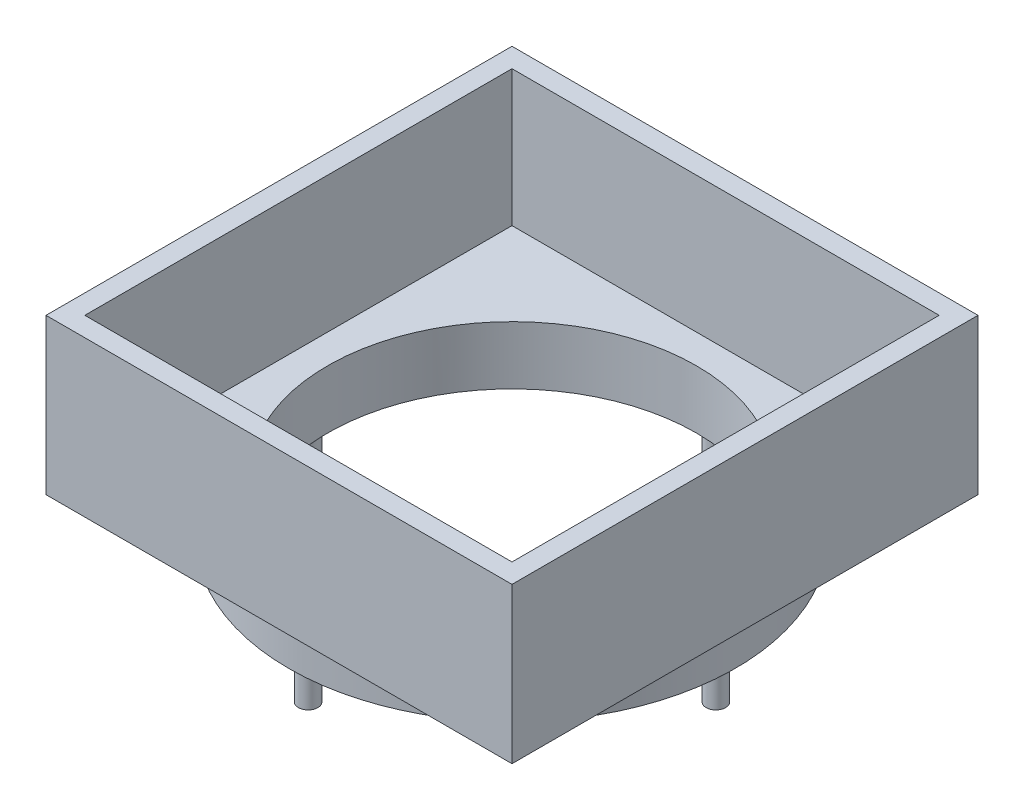
ISO-10303-21;
HEADER;
FILE_DESCRIPTION(('STEP AP214'),'2;1');
FILE_NAME('part.step','',(''),(''),'','','');
FILE_SCHEMA(('AUTOMOTIVE_DESIGN { 1 0 10303 214 1 1 1 1 }'));
ENDSEC;
DATA;
#1=APPLICATION_CONTEXT('core data for automotive mechanical design processes');
#2=APPLICATION_PROTOCOL_DEFINITION('international standard','automotive_design',2000,#1);
#3=PRODUCT_CONTEXT('',#1,'mechanical');
#4=PRODUCT('Part','Part','',(#3));
#5=PRODUCT_RELATED_PRODUCT_CATEGORY('part','',(#4));
#6=PRODUCT_DEFINITION_FORMATION('','',#4);
#7=PRODUCT_DEFINITION_CONTEXT('part definition',#1,'design');
#8=PRODUCT_DEFINITION('design','',#6,#7);
#9=PRODUCT_DEFINITION_SHAPE('','',#8);
#10=(LENGTH_UNIT() NAMED_UNIT(*) SI_UNIT(.MILLI.,.METRE.));
#11=(NAMED_UNIT(*) PLANE_ANGLE_UNIT() SI_UNIT($,.RADIAN.));
#12=(NAMED_UNIT(*) SI_UNIT($,.STERADIAN.) SOLID_ANGLE_UNIT());
#13=UNCERTAINTY_MEASURE_WITH_UNIT(LENGTH_MEASURE(1.E-05),#10,'distance_accuracy_value','');
#14=(GEOMETRIC_REPRESENTATION_CONTEXT(3) GLOBAL_UNCERTAINTY_ASSIGNED_CONTEXT((#13)) GLOBAL_UNIT_ASSIGNED_CONTEXT((#10,
#11,#12)) REPRESENTATION_CONTEXT('',''));
#15=CARTESIAN_POINT('',(0.,0.,0.));
#16=DIRECTION('',(0.,0.,1.));
#17=DIRECTION('',(1.,0.,0.));
#18=AXIS2_PLACEMENT_3D('',#15,#16,#17);
#19=CARTESIAN_POINT('',(0.,49.9999999999999,0.));
#20=DIRECTION('',(0.,-1.,0.));
#21=DIRECTION('',(0.,0.,-1.));
#22=AXIS2_PLACEMENT_3D('',#19,#20,#21);
#23=PLANE('',#22);
#24=DIRECTION('',(0.,0.,-1.));
#25=VECTOR('',#24,1.);
#26=CARTESIAN_POINT('',(60.,49.9999999999999,60.));
#27=LINE('',#26,#25);
#28=CARTESIAN_POINT('',(60.,49.9999999999999,60.));
#29=VERTEX_POINT('',#28);
#30=CARTESIAN_POINT('',(60.,49.9999999999999,-60.));
#31=VERTEX_POINT('',#30);
#32=EDGE_CURVE('E149',#29,#31,#27,.T.);
#33=ORIENTED_EDGE('',*,*,#32,.T.);
#34=DIRECTION('',(-1.,0.,0.));
#35=VECTOR('',#34,1.);
#36=CARTESIAN_POINT('',(-60.,49.9999999999999,-60.));
#37=LINE('',#36,#35);
#38=CARTESIAN_POINT('',(-60.,49.9999999999999,-60.));
#39=VERTEX_POINT('',#38);
#40=EDGE_CURVE('E88',#31,#39,#37,.T.);
#41=ORIENTED_EDGE('',*,*,#40,.T.);
#42=DIRECTION('',(0.,0.,1.));
#43=VECTOR('',#42,1.);
#44=CARTESIAN_POINT('',(-60.,49.9999999999999,60.));
#45=LINE('',#44,#43);
#46=CARTESIAN_POINT('',(-60.,49.9999999999999,60.));
#47=VERTEX_POINT('',#46);
#48=EDGE_CURVE('E152',#39,#47,#45,.T.);
#49=ORIENTED_EDGE('',*,*,#48,.T.);
#50=DIRECTION('',(1.,0.,0.));
#51=VECTOR('',#50,1.);
#52=CARTESIAN_POINT('',(-60.,49.9999999999999,60.));
#53=LINE('',#52,#51);
#54=EDGE_CURVE('E59',#47,#29,#53,.T.);
#55=ORIENTED_EDGE('',*,*,#54,.T.);
#56=EDGE_LOOP('',(#33,#41,#49,#55));
#57=FACE_BOUND('',#56,.T.);
#58=DIRECTION('',(0.,0.,-1.));
#59=VECTOR('',#58,1.);
#60=CARTESIAN_POINT('',(55.,49.9999999999999,0.));
#61=LINE('',#60,#59);
#62=CARTESIAN_POINT('',(55.,49.9999999999999,55.));
#63=VERTEX_POINT('',#62);
#64=CARTESIAN_POINT('',(55.,49.9999999999999,-55.));
#65=VERTEX_POINT('',#64);
#66=EDGE_CURVE('E117',#63,#65,#61,.T.);
#67=ORIENTED_EDGE('',*,*,#66,.F.);
#68=DIRECTION('',(1.,0.,0.));
#69=VECTOR('',#68,1.);
#70=CARTESIAN_POINT('',(0.,49.9999999999999,55.));
#71=LINE('',#70,#69);
#72=CARTESIAN_POINT('',(-55.,49.9999999999999,55.));
#73=VERTEX_POINT('',#72);
#74=EDGE_CURVE('E123',#73,#63,#71,.T.);
#75=ORIENTED_EDGE('',*,*,#74,.F.);
#76=DIRECTION('',(0.,0.,1.));
#77=VECTOR('',#76,1.);
#78=CARTESIAN_POINT('',(-55.,49.9999999999999,0.));
#79=LINE('',#78,#77);
#80=CARTESIAN_POINT('',(-55.,49.9999999999999,-55.));
#81=VERTEX_POINT('',#80);
#82=EDGE_CURVE('E146',#81,#73,#79,.T.);
#83=ORIENTED_EDGE('',*,*,#82,.F.);
#84=DIRECTION('',(-1.,0.,0.));
#85=VECTOR('',#84,1.);
#86=CARTESIAN_POINT('',(0.,49.9999999999999,-55.));
#87=LINE('',#86,#85);
#88=EDGE_CURVE('E144',#65,#81,#87,.T.);
#89=ORIENTED_EDGE('',*,*,#88,.F.);
#90=EDGE_LOOP('',(#67,#75,#83,#89));
#91=FACE_BOUND('',#90,.T.);
#92=ADVANCED_FACE('F33',(#57,#91),#23,.F.);
#93=CARTESIAN_POINT('',(0.,0.,0.));
#94=DIRECTION('',(0.,1.,0.));
#95=DIRECTION('',(0.,0.,1.));
#96=AXIS2_PLACEMENT_3D('',#93,#94,#95);
#97=PLANE('',#96);
#98=CARTESIAN_POINT('',(0.,0.,52.5));
#99=DIRECTION('',(0.,1.,0.));
#100=DIRECTION('',(0.,0.,1.));
#101=AXIS2_PLACEMENT_3D('',#98,#99,#100);
#102=CIRCLE('',#101,2.5);
#103=CARTESIAN_POINT('',(0.,0.,55.));
#104=VERTEX_POINT('',#103);
#105=EDGE_CURVE('E172',#104,#104,#102,.T.);
#106=ORIENTED_EDGE('',*,*,#105,.T.);
#107=EDGE_LOOP('',(#106));
#108=FACE_BOUND('',#107,.T.);
#109=CARTESIAN_POINT('',(52.5,0.,0.));
#110=DIRECTION('',(0.,1.,0.));
#111=DIRECTION('',(0.,0.,1.));
#112=AXIS2_PLACEMENT_3D('',#109,#110,#111);
#113=CIRCLE('',#112,2.5);
#114=CARTESIAN_POINT('',(52.5,0.,2.5));
#115=VERTEX_POINT('',#114);
#116=EDGE_CURVE('E178',#115,#115,#113,.T.);
#117=ORIENTED_EDGE('',*,*,#116,.T.);
#118=EDGE_LOOP('',(#117));
#119=FACE_BOUND('',#118,.T.);
#120=CARTESIAN_POINT('',(0.,0.,-52.5));
#121=DIRECTION('',(0.,1.,0.));
#122=DIRECTION('',(0.,0.,1.));
#123=AXIS2_PLACEMENT_3D('',#120,#121,#122);
#124=CIRCLE('',#123,2.5);
#125=CARTESIAN_POINT('',(0.,0.,-50.));
#126=VERTEX_POINT('',#125);
#127=EDGE_CURVE('E184',#126,#126,#124,.T.);
#128=ORIENTED_EDGE('',*,*,#127,.T.);
#129=EDGE_LOOP('',(#128));
#130=FACE_BOUND('',#129,.T.);
#131=CARTESIAN_POINT('',(-52.5,0.,0.));
#132=DIRECTION('',(0.,1.,0.));
#133=DIRECTION('',(0.,0.,1.));
#134=AXIS2_PLACEMENT_3D('',#131,#132,#133);
#135=CIRCLE('',#134,2.5);
#136=CARTESIAN_POINT('',(-52.5,0.,2.5));
#137=VERTEX_POINT('',#136);
#138=EDGE_CURVE('E187',#137,#137,#135,.T.);
#139=ORIENTED_EDGE('',*,*,#138,.T.);
#140=EDGE_LOOP('',(#139));
#141=FACE_BOUND('',#140,.T.);
#142=CARTESIAN_POINT('',(0.,0.,0.));
#143=DIRECTION('',(0.,1.,0.));
#144=DIRECTION('',(0.,0.,1.));
#145=AXIS2_PLACEMENT_3D('',#142,#143,#144);
#146=CIRCLE('',#145,57.5);
#147=CARTESIAN_POINT('',(0.,0.,57.5));
#148=VERTEX_POINT('',#147);
#149=EDGE_CURVE('E42',#148,#148,#146,.T.);
#150=ORIENTED_EDGE('',*,*,#149,.F.);
#151=EDGE_LOOP('',(#150));
#152=FACE_BOUND('',#151,.T.);
#153=CARTESIAN_POINT('',(0.,0.,0.));
#154=DIRECTION('',(0.,1.,0.));
#155=DIRECTION('',(0.,0.,1.));
#156=AXIS2_PLACEMENT_3D('',#153,#154,#155);
#157=CIRCLE('',#156,47.5);
#158=CARTESIAN_POINT('',(0.,0.,47.5));
#159=VERTEX_POINT('',#158);
#160=EDGE_CURVE('E193',#159,#159,#157,.T.);
#161=ORIENTED_EDGE('',*,*,#160,.T.);
#162=EDGE_LOOP('',(#161));
#163=FACE_BOUND('',#162,.T.);
#164=ADVANCED_FACE('F201',(#108,#119,#130,#141,#152,#163),#97,.F.);
#165=CARTESIAN_POINT('',(0.,10.,0.));
#166=DIRECTION('',(0.,-1.,0.));
#167=DIRECTION('',(0.,0.,-1.));
#168=AXIS2_PLACEMENT_3D('',#165,#166,#167);
#169=CYLINDRICAL_SURFACE('',#168,57.5);
#170=CARTESIAN_POINT('',(0.,10.,0.));
#171=DIRECTION('',(0.,1.,0.));
#172=DIRECTION('',(0.,0.,1.));
#173=AXIS2_PLACEMENT_3D('',#170,#171,#172);
#174=CIRCLE('',#173,57.5);
#175=CARTESIAN_POINT('',(0.,10.,57.5));
#176=VERTEX_POINT('',#175);
#177=EDGE_CURVE('E11',#176,#176,#174,.T.);
#178=ORIENTED_EDGE('',*,*,#177,.F.);
#179=EDGE_LOOP('',(#178));
#180=FACE_BOUND('',#179,.T.);
#181=ORIENTED_EDGE('',*,*,#149,.T.);
#182=EDGE_LOOP('',(#181));
#183=FACE_BOUND('',#182,.T.);
#184=ADVANCED_FACE('F35',(#180,#183),#169,.T.);
#185=CARTESIAN_POINT('',(0.,10.,0.));
#186=DIRECTION('',(0.,-1.,0.));
#187=DIRECTION('',(0.,0.,-1.));
#188=AXIS2_PLACEMENT_3D('',#185,#186,#187);
#189=CYLINDRICAL_SURFACE('',#188,47.5);
#190=ORIENTED_EDGE('',*,*,#160,.F.);
#191=EDGE_LOOP('',(#190));
#192=FACE_BOUND('',#191,.T.);
#193=CARTESIAN_POINT('',(0.,15.,0.));
#194=DIRECTION('',(0.,-1.,0.));
#195=DIRECTION('',(0.,0.,-1.));
#196=AXIS2_PLACEMENT_3D('',#193,#194,#195);
#197=CIRCLE('',#196,47.5);
#198=CARTESIAN_POINT('',(0.,15.,-47.5));
#199=VERTEX_POINT('',#198);
#200=EDGE_CURVE('E37',#199,#199,#197,.T.);
#201=ORIENTED_EDGE('',*,*,#200,.F.);
#202=EDGE_LOOP('',(#201));
#203=FACE_BOUND('',#202,.T.);
#204=ADVANCED_FACE('F207',(#192,#203),#189,.F.);
#205=CARTESIAN_POINT('',(-52.5,-10.,0.));
#206=DIRECTION('',(0.,1.,0.));
#207=DIRECTION('',(0.,0.,1.));
#208=AXIS2_PLACEMENT_3D('',#205,#206,#207);
#209=CYLINDRICAL_SURFACE('',#208,2.5);
#210=CARTESIAN_POINT('',(-52.5,-10.,0.));
#211=DIRECTION('',(0.,1.,0.));
#212=DIRECTION('',(0.,0.,1.));
#213=AXIS2_PLACEMENT_3D('',#210,#211,#212);
#214=CIRCLE('',#213,2.5);
#215=CARTESIAN_POINT('',(-52.5,-10.,2.5));
#216=VERTEX_POINT('',#215);
#217=EDGE_CURVE('E190',#216,#216,#214,.T.);
#218=ORIENTED_EDGE('',*,*,#217,.T.);
#219=EDGE_LOOP('',(#218));
#220=FACE_BOUND('',#219,.T.);
#221=ORIENTED_EDGE('',*,*,#138,.F.);
#222=EDGE_LOOP('',(#221));
#223=FACE_BOUND('',#222,.T.);
#224=ADVANCED_FACE('F210',(#220,#223),#209,.T.);
#225=CARTESIAN_POINT('',(-52.5,-10.,0.));
#226=DIRECTION('',(0.,1.,0.));
#227=DIRECTION('',(0.,0.,1.));
#228=AXIS2_PLACEMENT_3D('',#225,#226,#227);
#229=PLANE('',#228);
#230=ORIENTED_EDGE('',*,*,#217,.F.);
#231=EDGE_LOOP('',(#230));
#232=FACE_BOUND('',#231,.T.);
#233=ADVANCED_FACE('F267',(#232),#229,.F.);
#234=CARTESIAN_POINT('',(0.,-10.,-52.5));
#235=DIRECTION('',(0.,1.,0.));
#236=DIRECTION('',(0.,0.,1.));
#237=AXIS2_PLACEMENT_3D('',#234,#235,#236);
#238=CYLINDRICAL_SURFACE('',#237,2.5);
#239=CARTESIAN_POINT('',(0.,-10.,-52.5));
#240=DIRECTION('',(0.,1.,0.));
#241=DIRECTION('',(0.,0.,1.));
#242=AXIS2_PLACEMENT_3D('',#239,#240,#241);
#243=CIRCLE('',#242,2.5);
#244=CARTESIAN_POINT('',(0.,-10.,-50.));
#245=VERTEX_POINT('',#244);
#246=EDGE_CURVE('E181',#245,#245,#243,.T.);
#247=ORIENTED_EDGE('',*,*,#246,.T.);
#248=EDGE_LOOP('',(#247));
#249=FACE_BOUND('',#248,.T.);
#250=ORIENTED_EDGE('',*,*,#127,.F.);
#251=EDGE_LOOP('',(#250));
#252=FACE_BOUND('',#251,.T.);
#253=ADVANCED_FACE('F264',(#249,#252),#238,.T.);
#254=CARTESIAN_POINT('',(0.,-10.,-52.5));
#255=DIRECTION('',(0.,1.,0.));
#256=DIRECTION('',(0.,0.,1.));
#257=AXIS2_PLACEMENT_3D('',#254,#255,#256);
#258=PLANE('',#257);
#259=ORIENTED_EDGE('',*,*,#246,.F.);
#260=EDGE_LOOP('',(#259));
#261=FACE_BOUND('',#260,.T.);
#262=ADVANCED_FACE('F259',(#261),#258,.F.);
#263=CARTESIAN_POINT('',(52.5,-10.,0.));
#264=DIRECTION('',(0.,1.,0.));
#265=DIRECTION('',(0.,0.,1.));
#266=AXIS2_PLACEMENT_3D('',#263,#264,#265);
#267=CYLINDRICAL_SURFACE('',#266,2.5);
#268=CARTESIAN_POINT('',(52.5,-10.,0.));
#269=DIRECTION('',(0.,1.,0.));
#270=DIRECTION('',(0.,0.,1.));
#271=AXIS2_PLACEMENT_3D('',#268,#269,#270);
#272=CIRCLE('',#271,2.5);
#273=CARTESIAN_POINT('',(52.5,-10.,2.5));
#274=VERTEX_POINT('',#273);
#275=EDGE_CURVE('E175',#274,#274,#272,.T.);
#276=ORIENTED_EDGE('',*,*,#275,.T.);
#277=EDGE_LOOP('',(#276));
#278=FACE_BOUND('',#277,.T.);
#279=ORIENTED_EDGE('',*,*,#116,.F.);
#280=EDGE_LOOP('',(#279));
#281=FACE_BOUND('',#280,.T.);
#282=ADVANCED_FACE('F256',(#278,#281),#267,.T.);
#283=CARTESIAN_POINT('',(52.5,-10.,0.));
#284=DIRECTION('',(0.,1.,0.));
#285=DIRECTION('',(0.,0.,1.));
#286=AXIS2_PLACEMENT_3D('',#283,#284,#285);
#287=PLANE('',#286);
#288=ORIENTED_EDGE('',*,*,#275,.F.);
#289=EDGE_LOOP('',(#288));
#290=FACE_BOUND('',#289,.T.);
#291=ADVANCED_FACE('F251',(#290),#287,.F.);
#292=CARTESIAN_POINT('',(0.,-10.,52.5));
#293=DIRECTION('',(0.,1.,0.));
#294=DIRECTION('',(0.,0.,1.));
#295=AXIS2_PLACEMENT_3D('',#292,#293,#294);
#296=CYLINDRICAL_SURFACE('',#295,2.5);
#297=CARTESIAN_POINT('',(0.,-10.,52.5));
#298=DIRECTION('',(0.,1.,0.));
#299=DIRECTION('',(0.,0.,1.));
#300=AXIS2_PLACEMENT_3D('',#297,#298,#299);
#301=CIRCLE('',#300,2.5);
#302=CARTESIAN_POINT('',(0.,-10.,55.));
#303=VERTEX_POINT('',#302);
#304=EDGE_CURVE('E171',#303,#303,#301,.T.);
#305=ORIENTED_EDGE('',*,*,#304,.T.);
#306=EDGE_LOOP('',(#305));
#307=FACE_BOUND('',#306,.T.);
#308=ORIENTED_EDGE('',*,*,#105,.F.);
#309=EDGE_LOOP('',(#308));
#310=FACE_BOUND('',#309,.T.);
#311=ADVANCED_FACE('F248',(#307,#310),#296,.T.);
#312=CARTESIAN_POINT('',(0.,-10.,52.5));
#313=DIRECTION('',(0.,1.,0.));
#314=DIRECTION('',(0.,0.,1.));
#315=AXIS2_PLACEMENT_3D('',#312,#313,#314);
#316=PLANE('',#315);
#317=ORIENTED_EDGE('',*,*,#304,.F.);
#318=EDGE_LOOP('',(#317));
#319=FACE_BOUND('',#318,.T.);
#320=ADVANCED_FACE('F246',(#319),#316,.F.);
#321=CARTESIAN_POINT('',(60.,49.9999999999999,60.));
#322=DIRECTION('',(-1.,0.,0.));
#323=DIRECTION('',(0.,0.,1.));
#324=AXIS2_PLACEMENT_3D('',#321,#322,#323);
#325=PLANE('',#324);
#326=DIRECTION('',(0.,0.,-1.));
#327=VECTOR('',#326,1.);
#328=CARTESIAN_POINT('',(60.,10.,60.));
#329=LINE('',#328,#327);
#330=CARTESIAN_POINT('',(60.,10.,60.));
#331=VERTEX_POINT('',#330);
#332=CARTESIAN_POINT('',(60.,10.,-60.));
#333=VERTEX_POINT('',#332);
#334=EDGE_CURVE('E137',#331,#333,#329,.T.);
#335=ORIENTED_EDGE('',*,*,#334,.T.);
#336=DIRECTION('',(0.,-1.,0.));
#337=VECTOR('',#336,1.);
#338=CARTESIAN_POINT('',(60.,49.9999999999999,-60.));
#339=LINE('',#338,#337);
#340=EDGE_CURVE('E169',#31,#333,#339,.T.);
#341=ORIENTED_EDGE('',*,*,#340,.F.);
#342=ORIENTED_EDGE('',*,*,#32,.F.);
#343=DIRECTION('',(0.,-1.,0.));
#344=VECTOR('',#343,1.);
#345=CARTESIAN_POINT('',(60.,49.9999999999999,60.));
#346=LINE('',#345,#344);
#347=EDGE_CURVE('E155',#29,#331,#346,.T.);
#348=ORIENTED_EDGE('',*,*,#347,.T.);
#349=EDGE_LOOP('',(#335,#341,#342,#348));
#350=FACE_BOUND('',#349,.T.);
#351=ADVANCED_FACE('F243',(#350),#325,.F.);
#352=CARTESIAN_POINT('',(-60.,49.9999999999999,-60.));
#353=DIRECTION('',(0.,0.,1.));
#354=DIRECTION('',(1.,0.,0.));
#355=AXIS2_PLACEMENT_3D('',#352,#353,#354);
#356=PLANE('',#355);
#357=DIRECTION('',(-1.,0.,0.));
#358=VECTOR('',#357,1.);
#359=CARTESIAN_POINT('',(-60.,10.,-60.));
#360=LINE('',#359,#358);
#361=CARTESIAN_POINT('',(-60.,10.,-60.));
#362=VERTEX_POINT('',#361);
#363=EDGE_CURVE('E158',#333,#362,#360,.T.);
#364=ORIENTED_EDGE('',*,*,#363,.T.);
#365=DIRECTION('',(0.,-1.,0.));
#366=VECTOR('',#365,1.);
#367=CARTESIAN_POINT('',(-60.,49.9999999999999,-60.));
#368=LINE('',#367,#366);
#369=EDGE_CURVE('E166',#39,#362,#368,.T.);
#370=ORIENTED_EDGE('',*,*,#369,.F.);
#371=ORIENTED_EDGE('',*,*,#40,.F.);
#372=ORIENTED_EDGE('',*,*,#340,.T.);
#373=EDGE_LOOP('',(#364,#370,#371,#372));
#374=FACE_BOUND('',#373,.T.);
#375=ADVANCED_FACE('F239',(#374),#356,.F.);
#376=CARTESIAN_POINT('',(-60.,49.9999999999999,60.));
#377=DIRECTION('',(1.,0.,0.));
#378=DIRECTION('',(0.,0.,-1.));
#379=AXIS2_PLACEMENT_3D('',#376,#377,#378);
#380=PLANE('',#379);
#381=DIRECTION('',(0.,0.,1.));
#382=VECTOR('',#381,1.);
#383=CARTESIAN_POINT('',(-60.,10.,60.));
#384=LINE('',#383,#382);
#385=CARTESIAN_POINT('',(-60.,10.,60.));
#386=VERTEX_POINT('',#385);
#387=EDGE_CURVE('E160',#362,#386,#384,.T.);
#388=ORIENTED_EDGE('',*,*,#387,.T.);
#389=DIRECTION('',(0.,-1.,0.));
#390=VECTOR('',#389,1.);
#391=CARTESIAN_POINT('',(-60.,49.9999999999999,60.));
#392=LINE('',#391,#390);
#393=EDGE_CURVE('E164',#47,#386,#392,.T.);
#394=ORIENTED_EDGE('',*,*,#393,.F.);
#395=ORIENTED_EDGE('',*,*,#48,.F.);
#396=ORIENTED_EDGE('',*,*,#369,.T.);
#397=EDGE_LOOP('',(#388,#394,#395,#396));
#398=FACE_BOUND('',#397,.T.);
#399=ADVANCED_FACE('F236',(#398),#380,.F.);
#400=CARTESIAN_POINT('',(-60.,49.9999999999999,60.));
#401=DIRECTION('',(0.,0.,-1.));
#402=DIRECTION('',(-1.,0.,0.));
#403=AXIS2_PLACEMENT_3D('',#400,#401,#402);
#404=PLANE('',#403);
#405=DIRECTION('',(1.,0.,0.));
#406=VECTOR('',#405,1.);
#407=CARTESIAN_POINT('',(-60.,10.,60.));
#408=LINE('',#407,#406);
#409=EDGE_CURVE('E80',#386,#331,#408,.T.);
#410=ORIENTED_EDGE('',*,*,#409,.T.);
#411=ORIENTED_EDGE('',*,*,#347,.F.);
#412=ORIENTED_EDGE('',*,*,#54,.F.);
#413=ORIENTED_EDGE('',*,*,#393,.T.);
#414=EDGE_LOOP('',(#410,#411,#412,#413));
#415=FACE_BOUND('',#414,.T.);
#416=ADVANCED_FACE('F223',(#415),#404,.F.);
#417=CARTESIAN_POINT('',(0.,10.,0.));
#418=DIRECTION('',(0.,-1.,0.));
#419=DIRECTION('',(0.,0.,-1.));
#420=AXIS2_PLACEMENT_3D('',#417,#418,#419);
#421=PLANE('',#420);
#422=ORIENTED_EDGE('',*,*,#177,.T.);
#423=EDGE_LOOP('',(#422));
#424=FACE_BOUND('',#423,.T.);
#425=ORIENTED_EDGE('',*,*,#334,.F.);
#426=ORIENTED_EDGE('',*,*,#409,.F.);
#427=ORIENTED_EDGE('',*,*,#387,.F.);
#428=ORIENTED_EDGE('',*,*,#363,.F.);
#429=EDGE_LOOP('',(#425,#426,#427,#428));
#430=FACE_BOUND('',#429,.T.);
#431=ADVANCED_FACE('F215',(#424,#430),#421,.T.);
#432=CARTESIAN_POINT('',(0.,15.,0.));
#433=DIRECTION('',(0.,-1.,0.));
#434=DIRECTION('',(0.,0.,-1.));
#435=AXIS2_PLACEMENT_3D('',#432,#433,#434);
#436=PLANE('',#435);
#437=ORIENTED_EDGE('',*,*,#200,.T.);
#438=EDGE_LOOP('',(#437));
#439=FACE_BOUND('',#438,.T.);
#440=DIRECTION('',(0.,0.,-1.));
#441=VECTOR('',#440,1.);
#442=CARTESIAN_POINT('',(55.,15.,0.));
#443=LINE('',#442,#441);
#444=CARTESIAN_POINT('',(55.,15.,55.));
#445=VERTEX_POINT('',#444);
#446=CARTESIAN_POINT('',(55.,15.,-55.));
#447=VERTEX_POINT('',#446);
#448=EDGE_CURVE('E114',#445,#447,#443,.T.);
#449=ORIENTED_EDGE('',*,*,#448,.T.);
#450=DIRECTION('',(-1.,0.,0.));
#451=VECTOR('',#450,1.);
#452=CARTESIAN_POINT('',(0.,15.,-55.));
#453=LINE('',#452,#451);
#454=CARTESIAN_POINT('',(-55.,15.,-55.));
#455=VERTEX_POINT('',#454);
#456=EDGE_CURVE('E131',#447,#455,#453,.T.);
#457=ORIENTED_EDGE('',*,*,#456,.T.);
#458=DIRECTION('',(0.,0.,1.));
#459=VECTOR('',#458,1.);
#460=CARTESIAN_POINT('',(-55.,15.,0.));
#461=LINE('',#460,#459);
#462=CARTESIAN_POINT('',(-55.,15.,55.));
#463=VERTEX_POINT('',#462);
#464=EDGE_CURVE('E116',#455,#463,#461,.T.);
#465=ORIENTED_EDGE('',*,*,#464,.T.);
#466=DIRECTION('',(1.,0.,0.));
#467=VECTOR('',#466,1.);
#468=CARTESIAN_POINT('',(0.,15.,55.));
#469=LINE('',#468,#467);
#470=EDGE_CURVE('E110',#463,#445,#469,.T.);
#471=ORIENTED_EDGE('',*,*,#470,.T.);
#472=EDGE_LOOP('',(#449,#457,#465,#471));
#473=FACE_BOUND('',#472,.T.);
#474=ADVANCED_FACE('F112',(#439,#473),#436,.F.);
#475=CARTESIAN_POINT('',(55.,49.9999999999999,60.));
#476=DIRECTION('',(-1.,0.,0.));
#477=DIRECTION('',(0.,0.,1.));
#478=AXIS2_PLACEMENT_3D('',#475,#476,#477);
#479=PLANE('',#478);
#480=ORIENTED_EDGE('',*,*,#448,.F.);
#481=DIRECTION('',(0.,-1.,0.));
#482=VECTOR('',#481,1.);
#483=CARTESIAN_POINT('',(55.,49.9999999999999,55.));
#484=LINE('',#483,#482);
#485=EDGE_CURVE('E120',#63,#445,#484,.T.);
#486=ORIENTED_EDGE('',*,*,#485,.F.);
#487=ORIENTED_EDGE('',*,*,#66,.T.);
#488=DIRECTION('',(0.,-1.,0.));
#489=VECTOR('',#488,1.);
#490=CARTESIAN_POINT('',(55.,49.9999999999999,-55.));
#491=LINE('',#490,#489);
#492=EDGE_CURVE('E130',#65,#447,#491,.T.);
#493=ORIENTED_EDGE('',*,*,#492,.T.);
#494=EDGE_LOOP('',(#480,#486,#487,#493));
#495=FACE_BOUND('',#494,.T.);
#496=ADVANCED_FACE('F128',(#495),#479,.T.);
#497=CARTESIAN_POINT('',(-60.,49.9999999999999,-55.));
#498=DIRECTION('',(0.,0.,1.));
#499=DIRECTION('',(1.,0.,0.));
#500=AXIS2_PLACEMENT_3D('',#497,#498,#499);
#501=PLANE('',#500);
#502=ORIENTED_EDGE('',*,*,#456,.F.);
#503=ORIENTED_EDGE('',*,*,#492,.F.);
#504=ORIENTED_EDGE('',*,*,#88,.T.);
#505=DIRECTION('',(0.,-1.,0.));
#506=VECTOR('',#505,1.);
#507=CARTESIAN_POINT('',(-55.,49.9999999999999,-55.));
#508=LINE('',#507,#506);
#509=EDGE_CURVE('E138',#81,#455,#508,.T.);
#510=ORIENTED_EDGE('',*,*,#509,.T.);
#511=EDGE_LOOP('',(#502,#503,#504,#510));
#512=FACE_BOUND('',#511,.T.);
#513=ADVANCED_FACE('F221',(#512),#501,.T.);
#514=CARTESIAN_POINT('',(-55.,49.9999999999999,60.));
#515=DIRECTION('',(1.,0.,0.));
#516=DIRECTION('',(0.,0.,-1.));
#517=AXIS2_PLACEMENT_3D('',#514,#515,#516);
#518=PLANE('',#517);
#519=ORIENTED_EDGE('',*,*,#464,.F.);
#520=ORIENTED_EDGE('',*,*,#509,.F.);
#521=ORIENTED_EDGE('',*,*,#82,.T.);
#522=DIRECTION('',(0.,-1.,0.));
#523=VECTOR('',#522,1.);
#524=CARTESIAN_POINT('',(-55.,49.9999999999999,55.));
#525=LINE('',#524,#523);
#526=EDGE_CURVE('E50',#73,#463,#525,.T.);
#527=ORIENTED_EDGE('',*,*,#526,.T.);
#528=EDGE_LOOP('',(#519,#520,#521,#527));
#529=FACE_BOUND('',#528,.T.);
#530=ADVANCED_FACE('F355',(#529),#518,.T.);
#531=CARTESIAN_POINT('',(-60.,49.9999999999999,55.));
#532=DIRECTION('',(0.,0.,-1.));
#533=DIRECTION('',(-1.,0.,0.));
#534=AXIS2_PLACEMENT_3D('',#531,#532,#533);
#535=PLANE('',#534);
#536=ORIENTED_EDGE('',*,*,#470,.F.);
#537=ORIENTED_EDGE('',*,*,#526,.F.);
#538=ORIENTED_EDGE('',*,*,#74,.T.);
#539=ORIENTED_EDGE('',*,*,#485,.T.);
#540=EDGE_LOOP('',(#536,#537,#538,#539));
#541=FACE_BOUND('',#540,.T.);
#542=ADVANCED_FACE('F121',(#541),#535,.T.);
#543=CLOSED_SHELL('',(#92,#164,#184,#204,#224,#233,#253,#262,#282,#291,#311,#320,#351,#375,#399,
#416,#431,#474,#496,#513,#530,#542));
#544=MANIFOLD_SOLID_BREP('B2',#543);
#545=ADVANCED_BREP_SHAPE_REPRESENTATION('',(#18,#544),#14);
#546=SHAPE_DEFINITION_REPRESENTATION(#9,#545);
ENDSEC;
END-ISO-10303-21;
